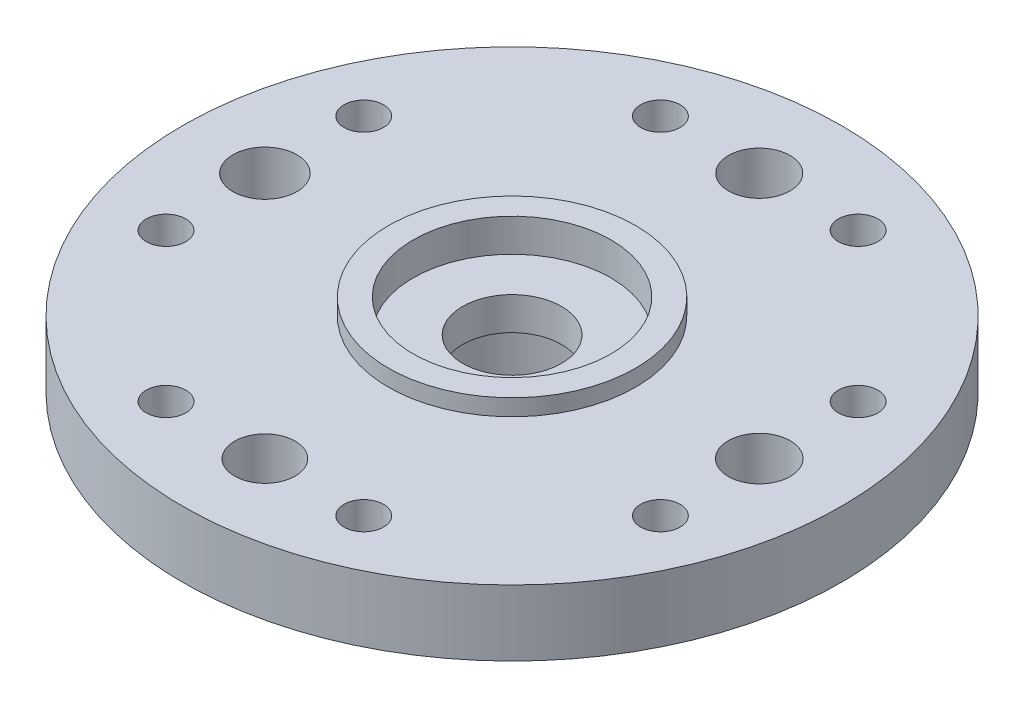
ISO-10303-21;
HEADER;
FILE_DESCRIPTION(('STEP AP214'),'2;1');
FILE_NAME('part.step','',(''),(''),'','','');
FILE_SCHEMA(('AUTOMOTIVE_DESIGN { 1 0 10303 214 1 1 1 1 }'));
ENDSEC;
DATA;
#1=APPLICATION_CONTEXT('core data for automotive mechanical design processes');
#2=APPLICATION_PROTOCOL_DEFINITION('international standard','automotive_design',2000,#1);
#3=PRODUCT_CONTEXT('',#1,'mechanical');
#4=PRODUCT('Part','Part','',(#3));
#5=PRODUCT_RELATED_PRODUCT_CATEGORY('part','',(#4));
#6=PRODUCT_DEFINITION_FORMATION('','',#4);
#7=PRODUCT_DEFINITION_CONTEXT('part definition',#1,'design');
#8=PRODUCT_DEFINITION('design','',#6,#7);
#9=PRODUCT_DEFINITION_SHAPE('','',#8);
#10=(LENGTH_UNIT() NAMED_UNIT(*) SI_UNIT(.MILLI.,.METRE.));
#11=(NAMED_UNIT(*) PLANE_ANGLE_UNIT() SI_UNIT($,.RADIAN.));
#12=(NAMED_UNIT(*) SI_UNIT($,.STERADIAN.) SOLID_ANGLE_UNIT());
#13=UNCERTAINTY_MEASURE_WITH_UNIT(LENGTH_MEASURE(1.E-05),#10,'distance_accuracy_value','');
#14=(GEOMETRIC_REPRESENTATION_CONTEXT(3) GLOBAL_UNCERTAINTY_ASSIGNED_CONTEXT((#13)) GLOBAL_UNIT_ASSIGNED_CONTEXT((#10,
#11,#12)) REPRESENTATION_CONTEXT('',''));
#15=CARTESIAN_POINT('',(0.,0.,0.));
#16=DIRECTION('',(0.,0.,1.));
#17=DIRECTION('',(1.,0.,0.));
#18=AXIS2_PLACEMENT_3D('',#15,#16,#17);
#19=CARTESIAN_POINT('',(4.5,0.,0.));
#20=DIRECTION('',(0.,-1.,0.));
#21=DIRECTION('',(0.,0.,-1.));
#22=AXIS2_PLACEMENT_3D('',#19,#20,#21);
#23=PLANE('',#22);
#24=CARTESIAN_POINT('',(0.,0.,0.));
#25=DIRECTION('',(0.,-1.,0.));
#26=DIRECTION('',(0.,0.,-1.));
#27=AXIS2_PLACEMENT_3D('',#24,#25,#26);
#28=CIRCLE('',#27,4.5);
#29=CARTESIAN_POINT('',(0.,0.,-4.5));
#30=VERTEX_POINT('',#29);
#31=EDGE_CURVE('E72',#30,#30,#28,.T.);
#32=ORIENTED_EDGE('',*,*,#31,.T.);
#33=EDGE_LOOP('',(#32));
#34=FACE_BOUND('',#33,.T.);
#35=CARTESIAN_POINT('',(0.,0.,0.));
#36=DIRECTION('',(0.,-1.,0.));
#37=DIRECTION('',(0.,0.,-1.));
#38=AXIS2_PLACEMENT_3D('',#35,#36,#37);
#39=CIRCLE('',#38,2.75);
#40=CARTESIAN_POINT('',(0.,0.,-2.75));
#41=VERTEX_POINT('',#40);
#42=EDGE_CURVE('E10',#41,#41,#39,.T.);
#43=ORIENTED_EDGE('',*,*,#42,.F.);
#44=EDGE_LOOP('',(#43));
#45=FACE_BOUND('',#44,.T.);
#46=ADVANCED_FACE('F32',(#34,#45),#23,.T.);
#47=CARTESIAN_POINT('',(0.,0.,0.));
#48=DIRECTION('',(0.,-1.,0.));
#49=DIRECTION('',(0.,0.,-1.));
#50=AXIS2_PLACEMENT_3D('',#47,#48,#49);
#51=CYLINDRICAL_SURFACE('',#50,2.75);
#52=ORIENTED_EDGE('',*,*,#42,.T.);
#53=EDGE_LOOP('',(#52));
#54=FACE_BOUND('',#53,.T.);
#55=CARTESIAN_POINT('',(0.,3.,0.));
#56=DIRECTION('',(0.,-1.,0.));
#57=DIRECTION('',(0.,0.,-1.));
#58=AXIS2_PLACEMENT_3D('',#55,#56,#57);
#59=CIRCLE('',#58,2.75);
#60=CARTESIAN_POINT('',(0.,3.,-2.75));
#61=VERTEX_POINT('',#60);
#62=EDGE_CURVE('E38',#61,#61,#59,.T.);
#63=ORIENTED_EDGE('',*,*,#62,.F.);
#64=EDGE_LOOP('',(#63));
#65=FACE_BOUND('',#64,.T.);
#66=ADVANCED_FACE('F190',(#54,#65),#51,.F.);
#67=CARTESIAN_POINT('',(2.75,3.,0.));
#68=DIRECTION('',(0.,-1.,0.));
#69=DIRECTION('',(0.,0.,-1.));
#70=AXIS2_PLACEMENT_3D('',#67,#68,#69);
#71=PLANE('',#70);
#72=ORIENTED_EDGE('',*,*,#62,.T.);
#73=EDGE_LOOP('',(#72));
#74=FACE_BOUND('',#73,.T.);
#75=CARTESIAN_POINT('',(0.,3.,0.));
#76=DIRECTION('',(0.,-1.,0.));
#77=DIRECTION('',(0.,0.,-1.));
#78=AXIS2_PLACEMENT_3D('',#75,#76,#77);
#79=CIRCLE('',#78,1.5);
#80=CARTESIAN_POINT('',(0.,3.,-1.5));
#81=VERTEX_POINT('',#80);
#82=EDGE_CURVE('E42',#81,#81,#79,.T.);
#83=ORIENTED_EDGE('',*,*,#82,.F.);
#84=EDGE_LOOP('',(#83));
#85=FACE_BOUND('',#84,.T.);
#86=ADVANCED_FACE('F194',(#74,#85),#71,.T.);
#87=CARTESIAN_POINT('',(0.,0.,0.));
#88=DIRECTION('',(0.,-1.,0.));
#89=DIRECTION('',(0.,0.,-1.));
#90=AXIS2_PLACEMENT_3D('',#87,#88,#89);
#91=CYLINDRICAL_SURFACE('',#90,1.5);
#92=ORIENTED_EDGE('',*,*,#82,.T.);
#93=EDGE_LOOP('',(#92));
#94=FACE_BOUND('',#93,.T.);
#95=CARTESIAN_POINT('',(0.,4.,0.));
#96=DIRECTION('',(0.,-1.,0.));
#97=DIRECTION('',(0.,0.,-1.));
#98=AXIS2_PLACEMENT_3D('',#95,#96,#97);
#99=CIRCLE('',#98,1.5);
#100=CARTESIAN_POINT('',(0.,4.,-1.5));
#101=VERTEX_POINT('',#100);
#102=EDGE_CURVE('E46',#101,#101,#99,.T.);
#103=ORIENTED_EDGE('',*,*,#102,.F.);
#104=EDGE_LOOP('',(#103));
#105=FACE_BOUND('',#104,.T.);
#106=ADVANCED_FACE('F198',(#94,#105),#91,.F.);
#107=CARTESIAN_POINT('',(1.5,4.,0.));
#108=DIRECTION('',(0.,1.,0.));
#109=DIRECTION('',(0.,0.,1.));
#110=AXIS2_PLACEMENT_3D('',#107,#108,#109);
#111=PLANE('',#110);
#112=ORIENTED_EDGE('',*,*,#102,.T.);
#113=EDGE_LOOP('',(#112));
#114=FACE_BOUND('',#113,.T.);
#115=CARTESIAN_POINT('',(0.,4.,0.));
#116=DIRECTION('',(0.,-1.,0.));
#117=DIRECTION('',(0.,0.,-1.));
#118=AXIS2_PLACEMENT_3D('',#115,#116,#117);
#119=CIRCLE('',#118,3.);
#120=CARTESIAN_POINT('',(0.,4.,-3.));
#121=VERTEX_POINT('',#120);
#122=EDGE_CURVE('E51',#121,#121,#119,.T.);
#123=ORIENTED_EDGE('',*,*,#122,.F.);
#124=EDGE_LOOP('',(#123));
#125=FACE_BOUND('',#124,.T.);
#126=ADVANCED_FACE('F204',(#114,#125),#111,.T.);
#127=CARTESIAN_POINT('',(0.,0.,0.));
#128=DIRECTION('',(0.,-1.,0.));
#129=DIRECTION('',(0.,0.,-1.));
#130=AXIS2_PLACEMENT_3D('',#127,#128,#129);
#131=CYLINDRICAL_SURFACE('',#130,3.);
#132=ORIENTED_EDGE('',*,*,#122,.T.);
#133=EDGE_LOOP('',(#132));
#134=FACE_BOUND('',#133,.T.);
#135=CARTESIAN_POINT('',(0.,5.,0.));
#136=DIRECTION('',(0.,-1.,0.));
#137=DIRECTION('',(0.,0.,-1.));
#138=AXIS2_PLACEMENT_3D('',#135,#136,#137);
#139=CIRCLE('',#138,3.);
#140=CARTESIAN_POINT('',(0.,5.,-3.));
#141=VERTEX_POINT('',#140);
#142=EDGE_CURVE('E54',#141,#141,#139,.T.);
#143=ORIENTED_EDGE('',*,*,#142,.F.);
#144=EDGE_LOOP('',(#143));
#145=FACE_BOUND('',#144,.T.);
#146=ADVANCED_FACE('F208',(#134,#145),#131,.F.);
#147=CARTESIAN_POINT('',(3.,5.,0.));
#148=DIRECTION('',(0.,1.,0.));
#149=DIRECTION('',(0.,0.,1.));
#150=AXIS2_PLACEMENT_3D('',#147,#148,#149);
#151=PLANE('',#150);
#152=ORIENTED_EDGE('',*,*,#142,.T.);
#153=EDGE_LOOP('',(#152));
#154=FACE_BOUND('',#153,.T.);
#155=CARTESIAN_POINT('',(0.,5.,0.));
#156=DIRECTION('',(0.,-1.,0.));
#157=DIRECTION('',(0.,0.,-1.));
#158=AXIS2_PLACEMENT_3D('',#155,#156,#157);
#159=CIRCLE('',#158,3.75);
#160=CARTESIAN_POINT('',(0.,5.,-3.75));
#161=VERTEX_POINT('',#160);
#162=EDGE_CURVE('E57',#161,#161,#159,.T.);
#163=ORIENTED_EDGE('',*,*,#162,.F.);
#164=EDGE_LOOP('',(#163));
#165=FACE_BOUND('',#164,.T.);
#166=ADVANCED_FACE('F212',(#154,#165),#151,.T.);
#167=CARTESIAN_POINT('',(0.,0.,0.));
#168=DIRECTION('',(0.,-1.,0.));
#169=DIRECTION('',(0.,0.,-1.));
#170=AXIS2_PLACEMENT_3D('',#167,#168,#169);
#171=CYLINDRICAL_SURFACE('',#170,3.75);
#172=ORIENTED_EDGE('',*,*,#162,.T.);
#173=EDGE_LOOP('',(#172));
#174=FACE_BOUND('',#173,.T.);
#175=CARTESIAN_POINT('',(0.,4.5,0.));
#176=DIRECTION('',(0.,-1.,0.));
#177=DIRECTION('',(0.,0.,-1.));
#178=AXIS2_PLACEMENT_3D('',#175,#176,#177);
#179=CIRCLE('',#178,3.75);
#180=CARTESIAN_POINT('',(0.,4.5,-3.75));
#181=VERTEX_POINT('',#180);
#182=EDGE_CURVE('E60',#181,#181,#179,.T.);
#183=ORIENTED_EDGE('',*,*,#182,.F.);
#184=EDGE_LOOP('',(#183));
#185=FACE_BOUND('',#184,.T.);
#186=ADVANCED_FACE('F216',(#174,#185),#171,.T.);
#187=CARTESIAN_POINT('',(3.75,4.5,0.));
#188=DIRECTION('',(0.,1.,0.));
#189=DIRECTION('',(0.,0.,1.));
#190=AXIS2_PLACEMENT_3D('',#187,#188,#189);
#191=PLANE('',#190);
#192=CARTESIAN_POINT('',(0.,4.5,-7.5));
#193=DIRECTION('',(0.,1.,0.));
#194=DIRECTION('',(0.,0.,1.));
#195=AXIS2_PLACEMENT_3D('',#192,#193,#194);
#196=CIRCLE('',#195,0.934495928061074);
#197=CARTESIAN_POINT('',(0.,4.5,-6.56550407193893));
#198=VERTEX_POINT('',#197);
#199=EDGE_CURVE('E119',#198,#198,#196,.T.);
#200=ORIENTED_EDGE('',*,*,#199,.F.);
#201=EDGE_LOOP('',(#200));
#202=FACE_BOUND('',#201,.T.);
#203=CARTESIAN_POINT('',(-7.5,4.5,0.));
#204=DIRECTION('',(0.,1.,0.));
#205=DIRECTION('',(0.,0.,1.));
#206=AXIS2_PLACEMENT_3D('',#203,#204,#205);
#207=CIRCLE('',#206,0.971023647366432);
#208=CARTESIAN_POINT('',(-7.5,4.5,0.971023647366353));
#209=VERTEX_POINT('',#208);
#210=EDGE_CURVE('E126',#209,#209,#207,.T.);
#211=ORIENTED_EDGE('',*,*,#210,.F.);
#212=EDGE_LOOP('',(#211));
#213=FACE_BOUND('',#212,.T.);
#214=CARTESIAN_POINT('',(0.,4.5,7.5));
#215=DIRECTION('',(0.,1.,0.));
#216=DIRECTION('',(0.,0.,1.));
#217=AXIS2_PLACEMENT_3D('',#214,#215,#216);
#218=CIRCLE('',#217,0.919680734852561);
#219=CARTESIAN_POINT('',(0.,4.5,8.41968073485256));
#220=VERTEX_POINT('',#219);
#221=EDGE_CURVE('E129',#220,#220,#218,.T.);
#222=ORIENTED_EDGE('',*,*,#221,.F.);
#223=EDGE_LOOP('',(#222));
#224=FACE_BOUND('',#223,.T.);
#225=CARTESIAN_POINT('',(7.5,4.5,0.));
#226=DIRECTION('',(0.,1.,0.));
#227=DIRECTION('',(0.,0.,1.));
#228=AXIS2_PLACEMENT_3D('',#225,#226,#227);
#229=CIRCLE('',#228,0.940854571853021);
#230=CARTESIAN_POINT('',(7.5,4.5,0.940854571853047));
#231=VERTEX_POINT('',#230);
#232=EDGE_CURVE('E132',#231,#231,#229,.T.);
#233=ORIENTED_EDGE('',*,*,#232,.F.);
#234=EDGE_LOOP('',(#233));
#235=FACE_BOUND('',#234,.T.);
#236=CARTESIAN_POINT('',(7.49999999999999,4.5,3.00000000000003));
#237=DIRECTION('',(0.,1.,0.));
#238=DIRECTION('',(-1.,0.,0.));
#239=AXIS2_PLACEMENT_3D('',#236,#237,#238);
#240=CIRCLE('',#239,0.6);
#241=CARTESIAN_POINT('',(6.89999999999999,4.5,3.00000000000002));
#242=VERTEX_POINT('',#241);
#243=EDGE_CURVE('E99',#242,#242,#240,.T.);
#244=ORIENTED_EDGE('',*,*,#243,.F.);
#245=EDGE_LOOP('',(#244));
#246=FACE_BOUND('',#245,.T.);
#247=CARTESIAN_POINT('',(7.50000000000001,4.5,-2.99999999999997));
#248=DIRECTION('',(0.,1.,0.));
#249=DIRECTION('',(1.,0.,0.));
#250=AXIS2_PLACEMENT_3D('',#247,#248,#249);
#251=CIRCLE('',#250,0.6);
#252=CARTESIAN_POINT('',(8.10000000000001,4.5,-2.99999999999997));
#253=VERTEX_POINT('',#252);
#254=EDGE_CURVE('E91',#253,#253,#251,.T.);
#255=ORIENTED_EDGE('',*,*,#254,.F.);
#256=EDGE_LOOP('',(#255));
#257=FACE_BOUND('',#256,.T.);
#258=CARTESIAN_POINT('',(-3.,4.5,7.5));
#259=DIRECTION('',(0.,1.,0.));
#260=DIRECTION('',(0.,0.,-1.));
#261=AXIS2_PLACEMENT_3D('',#258,#259,#260);
#262=CIRCLE('',#261,0.6);
#263=CARTESIAN_POINT('',(-3.,4.5,6.9));
#264=VERTEX_POINT('',#263);
#265=EDGE_CURVE('E92',#264,#264,#262,.T.);
#266=ORIENTED_EDGE('',*,*,#265,.F.);
#267=EDGE_LOOP('',(#266));
#268=FACE_BOUND('',#267,.T.);
#269=CARTESIAN_POINT('',(-7.50000000000003,4.5,2.99999999999992));
#270=DIRECTION('',(0.,1.,0.));
#271=DIRECTION('',(-1.,0.,0.));
#272=AXIS2_PLACEMENT_3D('',#269,#270,#271);
#273=CIRCLE('',#272,0.6);
#274=CARTESIAN_POINT('',(-8.10000000000003,4.5,2.99999999999992));
#275=VERTEX_POINT('',#274);
#276=EDGE_CURVE('E116',#275,#275,#273,.T.);
#277=ORIENTED_EDGE('',*,*,#276,.F.);
#278=EDGE_LOOP('',(#277));
#279=FACE_BOUND('',#278,.T.);
#280=CARTESIAN_POINT('',(-7.49999999999997,4.5,-3.00000000000008));
#281=DIRECTION('',(0.,1.,0.));
#282=DIRECTION('',(1.,0.,0.));
#283=AXIS2_PLACEMENT_3D('',#280,#281,#282);
#284=CIRCLE('',#283,0.6);
#285=CARTESIAN_POINT('',(-6.89999999999997,4.5,-3.00000000000007));
#286=VERTEX_POINT('',#285);
#287=EDGE_CURVE('E115',#286,#286,#284,.T.);
#288=ORIENTED_EDGE('',*,*,#287,.F.);
#289=EDGE_LOOP('',(#288));
#290=FACE_BOUND('',#289,.T.);
#291=CARTESIAN_POINT('',(3.,4.5,7.5));
#292=DIRECTION('',(0.,1.,0.));
#293=DIRECTION('',(0.,0.,1.));
#294=AXIS2_PLACEMENT_3D('',#291,#292,#293);
#295=CIRCLE('',#294,0.6);
#296=CARTESIAN_POINT('',(3.,4.5,8.1));
#297=VERTEX_POINT('',#296);
#298=EDGE_CURVE('E108',#297,#297,#295,.T.);
#299=ORIENTED_EDGE('',*,*,#298,.F.);
#300=EDGE_LOOP('',(#299));
#301=FACE_BOUND('',#300,.T.);
#302=CARTESIAN_POINT('',(-3.,4.5,-7.5));
#303=DIRECTION('',(0.,1.,0.));
#304=DIRECTION('',(0.,0.,-1.));
#305=AXIS2_PLACEMENT_3D('',#302,#303,#304);
#306=CIRCLE('',#305,0.6);
#307=CARTESIAN_POINT('',(-3.,4.5,-8.1));
#308=VERTEX_POINT('',#307);
#309=EDGE_CURVE('E80',#308,#308,#306,.T.);
#310=ORIENTED_EDGE('',*,*,#309,.F.);
#311=EDGE_LOOP('',(#310));
#312=FACE_BOUND('',#311,.T.);
#313=CARTESIAN_POINT('',(3.,4.5,-7.5));
#314=DIRECTION('',(0.,1.,0.));
#315=DIRECTION('',(0.,0.,1.));
#316=AXIS2_PLACEMENT_3D('',#313,#314,#315);
#317=CIRCLE('',#316,0.6);
#318=CARTESIAN_POINT('',(3.,4.5,-6.9));
#319=VERTEX_POINT('',#318);
#320=EDGE_CURVE('E79',#319,#319,#317,.T.);
#321=ORIENTED_EDGE('',*,*,#320,.F.);
#322=EDGE_LOOP('',(#321));
#323=FACE_BOUND('',#322,.T.);
#324=ORIENTED_EDGE('',*,*,#182,.T.);
#325=EDGE_LOOP('',(#324));
#326=FACE_BOUND('',#325,.T.);
#327=CARTESIAN_POINT('',(0.,4.5,0.));
#328=DIRECTION('',(0.,-1.,0.));
#329=DIRECTION('',(0.,0.,-1.));
#330=AXIS2_PLACEMENT_3D('',#327,#328,#329);
#331=CIRCLE('',#330,10.);
#332=CARTESIAN_POINT('',(0.,4.5,-10.));
#333=VERTEX_POINT('',#332);
#334=EDGE_CURVE('E63',#333,#333,#331,.T.);
#335=ORIENTED_EDGE('',*,*,#334,.F.);
#336=EDGE_LOOP('',(#335));
#337=FACE_BOUND('',#336,.T.);
#338=ADVANCED_FACE('F220',(#202,#213,#224,#235,#246,#257,#268,#279,#290,#301,#312,#323,#326,
#337),#191,.T.);
#339=CARTESIAN_POINT('',(0.,0.,0.));
#340=DIRECTION('',(0.,-1.,0.));
#341=DIRECTION('',(0.,0.,-1.));
#342=AXIS2_PLACEMENT_3D('',#339,#340,#341);
#343=CYLINDRICAL_SURFACE('',#342,10.);
#344=ORIENTED_EDGE('',*,*,#334,.T.);
#345=EDGE_LOOP('',(#344));
#346=FACE_BOUND('',#345,.T.);
#347=CARTESIAN_POINT('',(0.,2.5,0.));
#348=DIRECTION('',(0.,-1.,0.));
#349=DIRECTION('',(0.,0.,-1.));
#350=AXIS2_PLACEMENT_3D('',#347,#348,#349);
#351=CIRCLE('',#350,10.);
#352=CARTESIAN_POINT('',(0.,2.5,-10.));
#353=VERTEX_POINT('',#352);
#354=EDGE_CURVE('E66',#353,#353,#351,.T.);
#355=ORIENTED_EDGE('',*,*,#354,.F.);
#356=EDGE_LOOP('',(#355));
#357=FACE_BOUND('',#356,.T.);
#358=ADVANCED_FACE('F154',(#346,#357),#343,.T.);
#359=CARTESIAN_POINT('',(10.,2.5,0.));
#360=DIRECTION('',(0.,-1.,0.));
#361=DIRECTION('',(0.,0.,-1.));
#362=AXIS2_PLACEMENT_3D('',#359,#360,#361);
#363=PLANE('',#362);
#364=CARTESIAN_POINT('',(0.,2.5,-7.5));
#365=DIRECTION('',(0.,-1.,0.));
#366=DIRECTION('',(0.,0.,-1.));
#367=AXIS2_PLACEMENT_3D('',#364,#365,#366);
#368=CIRCLE('',#367,0.934495928061074);
#369=CARTESIAN_POINT('',(0.,2.5,-8.43449592806108));
#370=VERTEX_POINT('',#369);
#371=EDGE_CURVE('E135',#370,#370,#368,.T.);
#372=ORIENTED_EDGE('',*,*,#371,.F.);
#373=EDGE_LOOP('',(#372));
#374=FACE_BOUND('',#373,.T.);
#375=CARTESIAN_POINT('',(-7.5,2.5,0.));
#376=DIRECTION('',(0.,-1.,0.));
#377=DIRECTION('',(0.,0.,-1.));
#378=AXIS2_PLACEMENT_3D('',#375,#376,#377);
#379=CIRCLE('',#378,0.971023647366432);
#380=CARTESIAN_POINT('',(-7.5,2.5,-0.971023647366511));
#381=VERTEX_POINT('',#380);
#382=EDGE_CURVE('E142',#381,#381,#379,.T.);
#383=ORIENTED_EDGE('',*,*,#382,.F.);
#384=EDGE_LOOP('',(#383));
#385=FACE_BOUND('',#384,.T.);
#386=CARTESIAN_POINT('',(0.,2.5,7.5));
#387=DIRECTION('',(0.,-1.,0.));
#388=DIRECTION('',(0.,0.,-1.));
#389=AXIS2_PLACEMENT_3D('',#386,#387,#388);
#390=CIRCLE('',#389,0.919680734852561);
#391=CARTESIAN_POINT('',(0.,2.5,6.58031926514744));
#392=VERTEX_POINT('',#391);
#393=EDGE_CURVE('E139',#392,#392,#390,.T.);
#394=ORIENTED_EDGE('',*,*,#393,.F.);
#395=EDGE_LOOP('',(#394));
#396=FACE_BOUND('',#395,.T.);
#397=CARTESIAN_POINT('',(7.5,2.5,0.));
#398=DIRECTION('',(0.,-1.,0.));
#399=DIRECTION('',(0.,0.,-1.));
#400=AXIS2_PLACEMENT_3D('',#397,#398,#399);
#401=CIRCLE('',#400,0.940854571853021);
#402=CARTESIAN_POINT('',(7.5,2.5,-0.940854571852994));
#403=VERTEX_POINT('',#402);
#404=EDGE_CURVE('E136',#403,#403,#401,.T.);
#405=ORIENTED_EDGE('',*,*,#404,.F.);
#406=EDGE_LOOP('',(#405));
#407=FACE_BOUND('',#406,.T.);
#408=CARTESIAN_POINT('',(7.49999999999999,2.5,3.00000000000003));
#409=DIRECTION('',(0.,-1.,0.));
#410=DIRECTION('',(0.,0.,-1.));
#411=AXIS2_PLACEMENT_3D('',#408,#409,#410);
#412=CIRCLE('',#411,0.6);
#413=CARTESIAN_POINT('',(7.49999999999999,2.5,2.40000000000003));
#414=VERTEX_POINT('',#413);
#415=EDGE_CURVE('E83',#414,#414,#412,.F.);
#416=ORIENTED_EDGE('',*,*,#415,.T.);
#417=EDGE_LOOP('',(#416));
#418=FACE_BOUND('',#417,.T.);
#419=CARTESIAN_POINT('',(7.50000000000001,2.5,-2.99999999999997));
#420=DIRECTION('',(0.,-1.,0.));
#421=DIRECTION('',(0.,0.,-1.));
#422=AXIS2_PLACEMENT_3D('',#419,#420,#421);
#423=CIRCLE('',#422,0.6);
#424=CARTESIAN_POINT('',(7.50000000000001,2.5,-3.59999999999997));
#425=VERTEX_POINT('',#424);
#426=EDGE_CURVE('E96',#425,#425,#423,.F.);
#427=ORIENTED_EDGE('',*,*,#426,.T.);
#428=EDGE_LOOP('',(#427));
#429=FACE_BOUND('',#428,.T.);
#430=CARTESIAN_POINT('',(-3.,2.5,7.5));
#431=DIRECTION('',(0.,-1.,0.));
#432=DIRECTION('',(0.,0.,-1.));
#433=AXIS2_PLACEMENT_3D('',#430,#431,#432);
#434=CIRCLE('',#433,0.6);
#435=CARTESIAN_POINT('',(-3.,2.5,6.9));
#436=VERTEX_POINT('',#435);
#437=EDGE_CURVE('E88',#436,#436,#434,.F.);
#438=ORIENTED_EDGE('',*,*,#437,.T.);
#439=EDGE_LOOP('',(#438));
#440=FACE_BOUND('',#439,.T.);
#441=CARTESIAN_POINT('',(-7.50000000000003,2.5,2.99999999999992));
#442=DIRECTION('',(0.,-1.,0.));
#443=DIRECTION('',(0.,0.,-1.));
#444=AXIS2_PLACEMENT_3D('',#441,#442,#443);
#445=CIRCLE('',#444,0.6);
#446=CARTESIAN_POINT('',(-7.50000000000003,2.5,2.39999999999992));
#447=VERTEX_POINT('',#446);
#448=EDGE_CURVE('E112',#447,#447,#445,.F.);
#449=ORIENTED_EDGE('',*,*,#448,.T.);
#450=EDGE_LOOP('',(#449));
#451=FACE_BOUND('',#450,.T.);
#452=CARTESIAN_POINT('',(-7.49999999999997,2.5,-3.00000000000008));
#453=DIRECTION('',(0.,-1.,0.));
#454=DIRECTION('',(0.,0.,-1.));
#455=AXIS2_PLACEMENT_3D('',#452,#453,#454);
#456=CIRCLE('',#455,0.6);
#457=CARTESIAN_POINT('',(-7.49999999999997,2.5,-3.60000000000008));
#458=VERTEX_POINT('',#457);
#459=EDGE_CURVE('E111',#458,#458,#456,.F.);
#460=ORIENTED_EDGE('',*,*,#459,.T.);
#461=EDGE_LOOP('',(#460));
#462=FACE_BOUND('',#461,.T.);
#463=CARTESIAN_POINT('',(3.,2.5,7.5));
#464=DIRECTION('',(0.,-1.,0.));
#465=DIRECTION('',(0.,0.,-1.));
#466=AXIS2_PLACEMENT_3D('',#463,#464,#465);
#467=CIRCLE('',#466,0.6);
#468=CARTESIAN_POINT('',(3.,2.5,6.9));
#469=VERTEX_POINT('',#468);
#470=EDGE_CURVE('E95',#469,#469,#467,.F.);
#471=ORIENTED_EDGE('',*,*,#470,.T.);
#472=EDGE_LOOP('',(#471));
#473=FACE_BOUND('',#472,.T.);
#474=CARTESIAN_POINT('',(-3.,2.5,-7.5));
#475=DIRECTION('',(0.,-1.,0.));
#476=DIRECTION('',(0.,0.,-1.));
#477=AXIS2_PLACEMENT_3D('',#474,#475,#476);
#478=CIRCLE('',#477,0.6);
#479=CARTESIAN_POINT('',(-3.,2.5,-8.1));
#480=VERTEX_POINT('',#479);
#481=EDGE_CURVE('E76',#480,#480,#478,.F.);
#482=ORIENTED_EDGE('',*,*,#481,.T.);
#483=EDGE_LOOP('',(#482));
#484=FACE_BOUND('',#483,.T.);
#485=CARTESIAN_POINT('',(3.,2.5,-7.5));
#486=DIRECTION('',(0.,-1.,0.));
#487=DIRECTION('',(0.,0.,-1.));
#488=AXIS2_PLACEMENT_3D('',#485,#486,#487);
#489=CIRCLE('',#488,0.6);
#490=CARTESIAN_POINT('',(3.,2.5,-8.1));
#491=VERTEX_POINT('',#490);
#492=EDGE_CURVE('E75',#491,#491,#489,.F.);
#493=ORIENTED_EDGE('',*,*,#492,.T.);
#494=EDGE_LOOP('',(#493));
#495=FACE_BOUND('',#494,.T.);
#496=ORIENTED_EDGE('',*,*,#354,.T.);
#497=EDGE_LOOP('',(#496));
#498=FACE_BOUND('',#497,.T.);
#499=CARTESIAN_POINT('',(0.,2.5,0.));
#500=DIRECTION('',(0.,-1.,0.));
#501=DIRECTION('',(0.,0.,-1.));
#502=AXIS2_PLACEMENT_3D('',#499,#500,#501);
#503=CIRCLE('',#502,4.5);
#504=CARTESIAN_POINT('',(0.,2.5,-4.5));
#505=VERTEX_POINT('',#504);
#506=EDGE_CURVE('E69',#505,#505,#503,.T.);
#507=ORIENTED_EDGE('',*,*,#506,.F.);
#508=EDGE_LOOP('',(#507));
#509=FACE_BOUND('',#508,.T.);
#510=ADVANCED_FACE('F150',(#374,#385,#396,#407,#418,#429,#440,#451,#462,#473,#484,#495,#498,
#509),#363,.T.);
#511=CARTESIAN_POINT('',(0.,0.,0.));
#512=DIRECTION('',(0.,-1.,0.));
#513=DIRECTION('',(0.,0.,-1.));
#514=AXIS2_PLACEMENT_3D('',#511,#512,#513);
#515=CYLINDRICAL_SURFACE('',#514,4.5);
#516=ORIENTED_EDGE('',*,*,#506,.T.);
#517=EDGE_LOOP('',(#516));
#518=FACE_BOUND('',#517,.T.);
#519=ORIENTED_EDGE('',*,*,#31,.F.);
#520=EDGE_LOOP('',(#519));
#521=FACE_BOUND('',#520,.T.);
#522=ADVANCED_FACE('F153',(#518,#521),#515,.T.);
#523=CARTESIAN_POINT('',(3.,0.802943725152287,-7.5));
#524=DIRECTION('',(0.,1.,0.));
#525=DIRECTION('',(0.,0.,1.));
#526=AXIS2_PLACEMENT_3D('',#523,#524,#525);
#527=CYLINDRICAL_SURFACE('',#526,0.6);
#528=ORIENTED_EDGE('',*,*,#320,.T.);
#529=EDGE_LOOP('',(#528));
#530=FACE_BOUND('',#529,.T.);
#531=ORIENTED_EDGE('',*,*,#492,.F.);
#532=EDGE_LOOP('',(#531));
#533=FACE_BOUND('',#532,.T.);
#534=ADVANCED_FACE('F184',(#530,#533),#527,.F.);
#535=CARTESIAN_POINT('',(-3.,0.802943725152287,-7.5));
#536=DIRECTION('',(0.,1.,0.));
#537=DIRECTION('',(0.,0.,1.));
#538=AXIS2_PLACEMENT_3D('',#535,#536,#537);
#539=CYLINDRICAL_SURFACE('',#538,0.6);
#540=ORIENTED_EDGE('',*,*,#309,.T.);
#541=EDGE_LOOP('',(#540));
#542=FACE_BOUND('',#541,.T.);
#543=ORIENTED_EDGE('',*,*,#481,.F.);
#544=EDGE_LOOP('',(#543));
#545=FACE_BOUND('',#544,.T.);
#546=ADVANCED_FACE('F228',(#542,#545),#539,.F.);
#547=CARTESIAN_POINT('',(3.,0.802943725152287,7.5));
#548=DIRECTION('',(0.,1.,0.));
#549=DIRECTION('',(0.,0.,1.));
#550=AXIS2_PLACEMENT_3D('',#547,#548,#549);
#551=CYLINDRICAL_SURFACE('',#550,0.6);
#552=ORIENTED_EDGE('',*,*,#298,.T.);
#553=EDGE_LOOP('',(#552));
#554=FACE_BOUND('',#553,.T.);
#555=ORIENTED_EDGE('',*,*,#470,.F.);
#556=EDGE_LOOP('',(#555));
#557=FACE_BOUND('',#556,.T.);
#558=ADVANCED_FACE('F231',(#554,#557),#551,.F.);
#559=CARTESIAN_POINT('',(-7.49999999999997,0.802943725152287,-3.00000000000008));
#560=DIRECTION('',(0.,1.,0.));
#561=DIRECTION('',(0.,0.,1.));
#562=AXIS2_PLACEMENT_3D('',#559,#560,#561);
#563=CYLINDRICAL_SURFACE('',#562,0.6);
#564=ORIENTED_EDGE('',*,*,#287,.T.);
#565=EDGE_LOOP('',(#564));
#566=FACE_BOUND('',#565,.T.);
#567=ORIENTED_EDGE('',*,*,#459,.F.);
#568=EDGE_LOOP('',(#567));
#569=FACE_BOUND('',#568,.T.);
#570=ADVANCED_FACE('F252',(#566,#569),#563,.F.);
#571=CARTESIAN_POINT('',(-7.50000000000003,0.802943725152287,2.99999999999992));
#572=DIRECTION('',(0.,1.,0.));
#573=DIRECTION('',(0.,0.,1.));
#574=AXIS2_PLACEMENT_3D('',#571,#572,#573);
#575=CYLINDRICAL_SURFACE('',#574,0.6);
#576=ORIENTED_EDGE('',*,*,#276,.T.);
#577=EDGE_LOOP('',(#576));
#578=FACE_BOUND('',#577,.T.);
#579=ORIENTED_EDGE('',*,*,#448,.F.);
#580=EDGE_LOOP('',(#579));
#581=FACE_BOUND('',#580,.T.);
#582=ADVANCED_FACE('F240',(#578,#581),#575,.F.);
#583=CARTESIAN_POINT('',(-3.,0.802943725152287,7.5));
#584=DIRECTION('',(0.,1.,0.));
#585=DIRECTION('',(0.,0.,1.));
#586=AXIS2_PLACEMENT_3D('',#583,#584,#585);
#587=CYLINDRICAL_SURFACE('',#586,0.6);
#588=ORIENTED_EDGE('',*,*,#265,.T.);
#589=EDGE_LOOP('',(#588));
#590=FACE_BOUND('',#589,.T.);
#591=ORIENTED_EDGE('',*,*,#437,.F.);
#592=EDGE_LOOP('',(#591));
#593=FACE_BOUND('',#592,.T.);
#594=ADVANCED_FACE('F236',(#590,#593),#587,.F.);
#595=CARTESIAN_POINT('',(7.50000000000001,0.802943725152287,-2.99999999999997));
#596=DIRECTION('',(0.,1.,0.));
#597=DIRECTION('',(0.,0.,1.));
#598=AXIS2_PLACEMENT_3D('',#595,#596,#597);
#599=CYLINDRICAL_SURFACE('',#598,0.6);
#600=ORIENTED_EDGE('',*,*,#254,.T.);
#601=EDGE_LOOP('',(#600));
#602=FACE_BOUND('',#601,.T.);
#603=ORIENTED_EDGE('',*,*,#426,.F.);
#604=EDGE_LOOP('',(#603));
#605=FACE_BOUND('',#604,.T.);
#606=ADVANCED_FACE('F239',(#602,#605),#599,.F.);
#607=CARTESIAN_POINT('',(7.49999999999999,0.802943725152287,3.00000000000003));
#608=DIRECTION('',(0.,1.,0.));
#609=DIRECTION('',(0.,0.,1.));
#610=AXIS2_PLACEMENT_3D('',#607,#608,#609);
#611=CYLINDRICAL_SURFACE('',#610,0.6);
#612=ORIENTED_EDGE('',*,*,#243,.T.);
#613=EDGE_LOOP('',(#612));
#614=FACE_BOUND('',#613,.T.);
#615=ORIENTED_EDGE('',*,*,#415,.F.);
#616=EDGE_LOOP('',(#615));
#617=FACE_BOUND('',#616,.T.);
#618=ADVANCED_FACE('F244',(#614,#617),#611,.F.);
#619=CARTESIAN_POINT('',(7.5,5.,0.));
#620=DIRECTION('',(0.,-1.,0.));
#621=DIRECTION('',(0.,0.,-1.));
#622=AXIS2_PLACEMENT_3D('',#619,#620,#621);
#623=CYLINDRICAL_SURFACE('',#622,0.940854571853021);
#624=ORIENTED_EDGE('',*,*,#232,.T.);
#625=EDGE_LOOP('',(#624));
#626=FACE_BOUND('',#625,.T.);
#627=ORIENTED_EDGE('',*,*,#404,.T.);
#628=EDGE_LOOP('',(#627));
#629=FACE_BOUND('',#628,.T.);
#630=ADVANCED_FACE('F248',(#626,#629),#623,.F.);
#631=CARTESIAN_POINT('',(0.,5.,7.5));
#632=DIRECTION('',(0.,-1.,0.));
#633=DIRECTION('',(0.,0.,-1.));
#634=AXIS2_PLACEMENT_3D('',#631,#632,#633);
#635=CYLINDRICAL_SURFACE('',#634,0.919680734852561);
#636=ORIENTED_EDGE('',*,*,#221,.T.);
#637=EDGE_LOOP('',(#636));
#638=FACE_BOUND('',#637,.T.);
#639=ORIENTED_EDGE('',*,*,#393,.T.);
#640=EDGE_LOOP('',(#639));
#641=FACE_BOUND('',#640,.T.);
#642=ADVANCED_FACE('F262',(#638,#641),#635,.F.);
#643=CARTESIAN_POINT('',(-7.5,5.,0.));
#644=DIRECTION('',(0.,-1.,0.));
#645=DIRECTION('',(0.,0.,-1.));
#646=AXIS2_PLACEMENT_3D('',#643,#644,#645);
#647=CYLINDRICAL_SURFACE('',#646,0.971023647366432);
#648=ORIENTED_EDGE('',*,*,#210,.T.);
#649=EDGE_LOOP('',(#648));
#650=FACE_BOUND('',#649,.T.);
#651=ORIENTED_EDGE('',*,*,#382,.T.);
#652=EDGE_LOOP('',(#651));
#653=FACE_BOUND('',#652,.T.);
#654=ADVANCED_FACE('F266',(#650,#653),#647,.F.);
#655=CARTESIAN_POINT('',(0.,5.,-7.5));
#656=DIRECTION('',(0.,-1.,0.));
#657=DIRECTION('',(0.,0.,-1.));
#658=AXIS2_PLACEMENT_3D('',#655,#656,#657);
#659=CYLINDRICAL_SURFACE('',#658,0.934495928061074);
#660=ORIENTED_EDGE('',*,*,#199,.T.);
#661=EDGE_LOOP('',(#660));
#662=FACE_BOUND('',#661,.T.);
#663=ORIENTED_EDGE('',*,*,#371,.T.);
#664=EDGE_LOOP('',(#663));
#665=FACE_BOUND('',#664,.T.);
#666=ADVANCED_FACE('F148',(#662,#665),#659,.F.);
#667=CLOSED_SHELL('',(#46,#66,#86,#106,#126,#146,#166,#186,#338,#358,#510,#522,#534,#546,#558,
#570,#582,#594,#606,#618,#630,#642,#654,#666));
#668=MANIFOLD_SOLID_BREP('B2',#667);
#669=ADVANCED_BREP_SHAPE_REPRESENTATION('',(#18,#668),#14);
#670=SHAPE_DEFINITION_REPRESENTATION(#9,#669);
ENDSEC;
END-ISO-10303-21;
